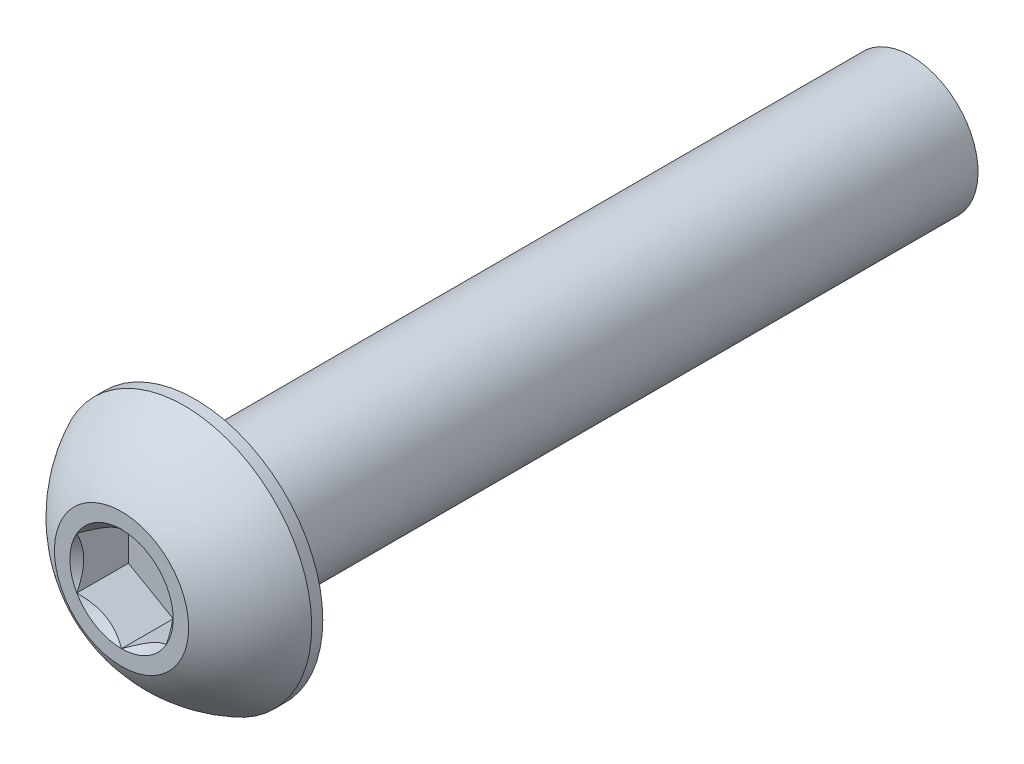
ISO-10303-21;
HEADER;
FILE_DESCRIPTION(('STEP AP214'),'2;1');
FILE_NAME('part.step','',(''),(''),'','','');
FILE_SCHEMA(('AUTOMOTIVE_DESIGN { 1 0 10303 214 1 1 1 1 }'));
ENDSEC;
DATA;
#1=APPLICATION_CONTEXT('core data for automotive mechanical design processes');
#2=APPLICATION_PROTOCOL_DEFINITION('international standard','automotive_design',2000,#1);
#3=PRODUCT_CONTEXT('',#1,'mechanical');
#4=PRODUCT('Part','Part','',(#3));
#5=PRODUCT_RELATED_PRODUCT_CATEGORY('part','',(#4));
#6=PRODUCT_DEFINITION_FORMATION('','',#4);
#7=PRODUCT_DEFINITION_CONTEXT('part definition',#1,'design');
#8=PRODUCT_DEFINITION('design','',#6,#7);
#9=PRODUCT_DEFINITION_SHAPE('','',#8);
#10=(LENGTH_UNIT() NAMED_UNIT(*) SI_UNIT(.MILLI.,.METRE.));
#11=(NAMED_UNIT(*) PLANE_ANGLE_UNIT() SI_UNIT($,.RADIAN.));
#12=(NAMED_UNIT(*) SI_UNIT($,.STERADIAN.) SOLID_ANGLE_UNIT());
#13=UNCERTAINTY_MEASURE_WITH_UNIT(LENGTH_MEASURE(1.E-05),#10,'distance_accuracy_value','');
#14=(GEOMETRIC_REPRESENTATION_CONTEXT(3) GLOBAL_UNCERTAINTY_ASSIGNED_CONTEXT((#13)) GLOBAL_UNIT_ASSIGNED_CONTEXT((#10,
#11,#12)) REPRESENTATION_CONTEXT('',''));
#15=CARTESIAN_POINT('',(0.,0.,0.));
#16=DIRECTION('',(0.,0.,1.));
#17=DIRECTION('',(1.,0.,0.));
#18=AXIS2_PLACEMENT_3D('',#15,#16,#17);
#19=CARTESIAN_POINT('',(-2.86,-2.85,-1.65));
#20=DIRECTION('',(0.,0.,-1.));
#21=DIRECTION('',(0.,1.,0.));
#22=AXIS2_PLACEMENT_3D('',#19,#20,#21);
#23=PLANE('',#22);
#24=CARTESIAN_POINT('',(0.,0.,-1.65));
#25=DIRECTION('',(0.,0.,1.));
#26=DIRECTION('',(1.,0.,0.));
#27=AXIS2_PLACEMENT_3D('',#24,#25,#26);
#28=CIRCLE('',#27,2.85);
#29=CARTESIAN_POINT('',(2.85,0.,-1.65));
#30=VERTEX_POINT('',#29);
#31=EDGE_CURVE('E371',#30,#30,#28,.T.);
#32=ORIENTED_EDGE('',*,*,#31,.F.);
#33=EDGE_LOOP('',(#32));
#34=FACE_BOUND('',#33,.T.);
#35=ADVANCED_FACE('F45',(#34),#23,.T.);
#36=CARTESIAN_POINT('',(1.,-0.577350269189626,-1.155));
#37=DIRECTION('',(0.,0.,1.));
#38=DIRECTION('',(1.,0.,0.));
#39=AXIS2_PLACEMENT_3D('',#36,#37,#38);
#40=PLANE('',#39);
#41=DIRECTION('',(0.866025403784438,0.5,0.));
#42=VECTOR('',#41,1.);
#43=CARTESIAN_POINT('',(0.,-1.15470053837925,-1.155));
#44=LINE('',#43,#42);
#45=CARTESIAN_POINT('',(0.,-1.15470053837925,-1.155));
#46=VERTEX_POINT('',#45);
#47=CARTESIAN_POINT('',(1.,-0.577350269189626,-1.155));
#48=VERTEX_POINT('',#47);
#49=EDGE_CURVE('E111',#46,#48,#44,.T.);
#50=ORIENTED_EDGE('',*,*,#49,.T.);
#51=DIRECTION('',(0.,1.,0.));
#52=VECTOR('',#51,1.);
#53=CARTESIAN_POINT('',(1.,-0.577350269189626,-1.155));
#54=LINE('',#53,#52);
#55=CARTESIAN_POINT('',(1.,0.577350269189626,-1.155));
#56=VERTEX_POINT('',#55);
#57=EDGE_CURVE('E168',#48,#56,#54,.T.);
#58=ORIENTED_EDGE('',*,*,#57,.T.);
#59=DIRECTION('',(-0.866025403784439,0.5,0.));
#60=VECTOR('',#59,1.);
#61=CARTESIAN_POINT('',(1.,0.577350269189626,-1.155));
#62=LINE('',#61,#60);
#63=CARTESIAN_POINT('',(0.,1.15470053837925,-1.155));
#64=VERTEX_POINT('',#63);
#65=EDGE_CURVE('E148',#56,#64,#62,.T.);
#66=ORIENTED_EDGE('',*,*,#65,.T.);
#67=DIRECTION('',(-0.866025403784438,-0.5,0.));
#68=VECTOR('',#67,1.);
#69=CARTESIAN_POINT('',(0.,1.15470053837925,-1.155));
#70=LINE('',#69,#68);
#71=CARTESIAN_POINT('',(-1.,0.577350269189626,-1.155));
#72=VERTEX_POINT('',#71);
#73=EDGE_CURVE('E164',#64,#72,#70,.T.);
#74=ORIENTED_EDGE('',*,*,#73,.T.);
#75=DIRECTION('',(0.,-1.,0.));
#76=VECTOR('',#75,1.);
#77=CARTESIAN_POINT('',(-1.,0.577350269189626,-1.155));
#78=LINE('',#77,#76);
#79=CARTESIAN_POINT('',(-1.,-0.577350269189626,-1.155));
#80=VERTEX_POINT('',#79);
#81=EDGE_CURVE('E161',#72,#80,#78,.T.);
#82=ORIENTED_EDGE('',*,*,#81,.T.);
#83=DIRECTION('',(0.866025403784439,-0.5,0.));
#84=VECTOR('',#83,1.);
#85=CARTESIAN_POINT('',(-1.,-0.577350269189626,-1.155));
#86=LINE('',#85,#84);
#87=EDGE_CURVE('E152',#80,#46,#86,.T.);
#88=ORIENTED_EDGE('',*,*,#87,.T.);
#89=EDGE_LOOP('',(#50,#58,#66,#74,#82,#88));
#90=FACE_BOUND('',#89,.T.);
#91=ADVANCED_FACE('F187',(#90),#40,.T.);
#92=CARTESIAN_POINT('',(-1.,-0.577350269189626,-1.155));
#93=DIRECTION('',(-0.5,-0.866025403784439,0.));
#94=DIRECTION('',(0.866025403784439,-0.5,0.));
#95=AXIS2_PLACEMENT_3D('',#92,#93,#94);
#96=PLANE('',#95);
#97=DIRECTION('',(0.,0.,1.));
#98=VECTOR('',#97,1.);
#99=CARTESIAN_POINT('',(-1.,-0.577350269189626,-1.155));
#100=LINE('',#99,#98);
#101=CARTESIAN_POINT('',(-1.,-0.577350269189626,0.));
#102=VERTEX_POINT('',#101);
#103=EDGE_CURVE('E118',#80,#102,#100,.T.);
#104=ORIENTED_EDGE('',*,*,#103,.T.);
#105=CARTESIAN_POINT('',(-1.0002,-0.577234799135788,0.000115487372614006));
#106=CARTESIAN_POINT('',(-0.965817404992819,-0.597085599618622,-0.0197220691742671));
#107=CARTESIAN_POINT('',(-0.930859881860175,-0.617268335009457,-0.0383949793611112));
#108=CARTESIAN_POINT('',(-0.859577197043911,-0.658423412276686,-0.072585257276842));
#109=CARTESIAN_POINT('',(-0.823245249471016,-0.67939967198808,-0.0880835909765412));
#110=CARTESIAN_POINT('',(-0.749983386196689,-0.721697428470847,-0.114632692857735));
#111=CARTESIAN_POINT('',(-0.713072148554586,-0.743008141459637,-0.125750226003074));
#112=CARTESIAN_POINT('',(-0.638437270689141,-0.786098608286186,-0.142880134223818));
#113=CARTESIAN_POINT('',(-0.600715911891365,-0.807877044942281,-0.148905302533327));
#114=CARTESIAN_POINT('',(-0.535707801582067,-0.845409494928863,-0.154339445032506));
#115=CARTESIAN_POINT('',(-0.508505628471828,-0.861114676896602,-0.155143061683268));
#116=CARTESIAN_POINT('',(-0.454153959330888,-0.892494627706029,-0.153793300583113));
#117=CARTESIAN_POINT('',(-0.427004476245125,-0.908169389073954,-0.151639270452801));
#118=CARTESIAN_POINT('',(-0.34594372267304,-0.954969836969511,-0.140883027871529));
#119=CARTESIAN_POINT('',(-0.292435859021573,-0.985862616452447,-0.127985443584644));
#120=CARTESIAN_POINT('',(-0.198523934856569,-1.04008269114923,-0.0968592693978226));
#121=CARTESIAN_POINT('',(-0.157679476328166,-1.06366425027551,-0.0802622022981606));
#122=CARTESIAN_POINT('',(-0.0775903626180563,-1.1099037216352,-0.0428750753147073));
#123=CARTESIAN_POINT('',(-0.0383409891295622,-1.1325643579843,-0.0220986581825968));
#124=CARTESIAN_POINT('',(0.000199999999999995,-1.15481600843309,0.000115487372613952));
#125=B_SPLINE_CURVE_WITH_KNOTS('',3,(#105,#106,#107,#108,#109,#110,#111,#112,#113,#114,#115,
#116,#117,#118,#119,#120,#121,#122,#123,#124),.UNSPECIFIED.,.F.,.F.,(4,2,2,2,2,2,2,2,2,4),(0.,
0.133237676828559,0.26725222983449,0.3991370762693,0.530689603280768,0.624814864263846,
0.718960890149132,0.907306626112097,1.05710100361789,1.20641411519286),.UNSPECIFIED.);
#126=CARTESIAN_POINT('',(0.,-1.15470053837925,0.));
#127=VERTEX_POINT('',#126);
#128=EDGE_CURVE('E103',#102,#127,#125,.T.);
#129=ORIENTED_EDGE('',*,*,#128,.T.);
#130=DIRECTION('',(0.,0.,1.));
#131=VECTOR('',#130,1.);
#132=CARTESIAN_POINT('',(0.,-1.15470053837925,-1.155));
#133=LINE('',#132,#131);
#134=EDGE_CURVE('E117',#46,#127,#133,.T.);
#135=ORIENTED_EDGE('',*,*,#134,.F.);
#136=ORIENTED_EDGE('',*,*,#87,.F.);
#137=EDGE_LOOP('',(#104,#129,#135,#136));
#138=FACE_BOUND('',#137,.T.);
#139=ADVANCED_FACE('F115',(#138),#96,.F.);
#140=CARTESIAN_POINT('',(0.,-1.15470053837925,-1.155));
#141=DIRECTION('',(0.5,-0.866025403784438,0.));
#142=DIRECTION('',(0.866025403784438,0.5,0.));
#143=AXIS2_PLACEMENT_3D('',#140,#141,#142);
#144=PLANE('',#143);
#145=ORIENTED_EDGE('',*,*,#134,.T.);
#146=CARTESIAN_POINT('',(-0.000200000000000057,-1.15481600843309,0.000115487372614094));
#147=CARTESIAN_POINT('',(0.0341825950071806,-1.13496520795026,-0.019722069174267));
#148=CARTESIAN_POINT('',(0.0691401181398248,-1.11478247255942,-0.0383949793611112));
#149=CARTESIAN_POINT('',(0.14042280295609,-1.07362739529219,-0.0725852572768421));
#150=CARTESIAN_POINT('',(0.176754750528984,-1.0526511355808,-0.0880835909765414));
#151=CARTESIAN_POINT('',(0.250016613803311,-1.01035337909803,-0.114632692857735));
#152=CARTESIAN_POINT('',(0.286927851445414,-0.989042666109241,-0.125750226003074));
#153=CARTESIAN_POINT('',(0.361562729310859,-0.945952199282691,-0.142880134223818));
#154=CARTESIAN_POINT('',(0.399284088108636,-0.924173762626596,-0.148905302533327));
#155=CARTESIAN_POINT('',(0.464292198417934,-0.886641312640014,-0.154339445032507));
#156=CARTESIAN_POINT('',(0.491494371528173,-0.870936130672275,-0.155143061683268));
#157=CARTESIAN_POINT('',(0.545846040669112,-0.839556179862848,-0.153793300583113));
#158=CARTESIAN_POINT('',(0.572995523754876,-0.823881418494923,-0.151639270452801));
#159=CARTESIAN_POINT('',(0.65405627732696,-0.777080970599366,-0.140883027871529));
#160=CARTESIAN_POINT('',(0.707564140978428,-0.74618819111643,-0.127985443584644));
#161=CARTESIAN_POINT('',(0.801476065143432,-0.691968116419649,-0.0968592693978231));
#162=CARTESIAN_POINT('',(0.842320523671834,-0.668386557293371,-0.080262202298161));
#163=CARTESIAN_POINT('',(0.922409637381944,-0.622147085933681,-0.0428750753147077));
#164=CARTESIAN_POINT('',(0.961659010870438,-0.599486449584575,-0.0220986581825972));
#165=CARTESIAN_POINT('',(1.0002,-0.577234799135788,0.000115487372613412));
#166=B_SPLINE_CURVE_WITH_KNOTS('',3,(#146,#147,#148,#149,#150,#151,#152,#153,#154,#155,#156,
#157,#158,#159,#160,#161,#162,#163,#164,#165),.UNSPECIFIED.,.F.,.F.,(4,2,2,2,2,2,2,2,2,4),(0.,
0.133237676828559,0.26725222983449,0.399137076269301,0.530689603280769,0.624814864263847,
0.718960890149134,0.907306626112098,1.05710100361789,1.20641411519286),.UNSPECIFIED.);
#167=CARTESIAN_POINT('',(1.,-0.577350269189626,0.));
#168=VERTEX_POINT('',#167);
#169=EDGE_CURVE('E108',#127,#168,#166,.T.);
#170=ORIENTED_EDGE('',*,*,#169,.T.);
#171=DIRECTION('',(0.,0.,1.));
#172=VECTOR('',#171,1.);
#173=CARTESIAN_POINT('',(1.,-0.577350269189626,-1.155));
#174=LINE('',#173,#172);
#175=EDGE_CURVE('E66',#48,#168,#174,.T.);
#176=ORIENTED_EDGE('',*,*,#175,.F.);
#177=ORIENTED_EDGE('',*,*,#49,.F.);
#178=EDGE_LOOP('',(#145,#170,#176,#177));
#179=FACE_BOUND('',#178,.T.);
#180=ADVANCED_FACE('F121',(#179),#144,.F.);
#181=CARTESIAN_POINT('',(1.,-0.577350269189626,-1.155));
#182=DIRECTION('',(1.,0.,0.));
#183=DIRECTION('',(0.,0.,-1.));
#184=AXIS2_PLACEMENT_3D('',#181,#182,#183);
#185=PLANE('',#184);
#186=ORIENTED_EDGE('',*,*,#175,.T.);
#187=CARTESIAN_POINT('',(1.,-1.15147208646462,0.370385677513861));
#188=CARTESIAN_POINT('',(1.,-1.12343447988552,0.349219919873711));
#189=CARTESIAN_POINT('',(1.,-1.09524064850697,0.328261692175909));
#190=CARTESIAN_POINT('',(1.,-1.03847715644376,0.286846022235621));
#191=CARTESIAN_POINT('',(1.,-1.00990740382975,0.266388706123658));
#192=CARTESIAN_POINT('',(1.,-0.923120894333477,0.205604794954508));
#193=CARTESIAN_POINT('',(1.,-0.864253173759059,0.166192228961397));
#194=CARTESIAN_POINT('',(1.,-0.740809858258045,0.0888206642002043));
#195=CARTESIAN_POINT('',(1.,-0.676100255137807,0.0510730391143415));
#196=CARTESIAN_POINT('',(1.,-0.543448939049124,-0.0179754124487089));
#197=CARTESIAN_POINT('',(1.,-0.475519112027779,-0.0492979721531354));
#198=CARTESIAN_POINT('',(1.,-0.373555850333529,-0.0876182211162059));
#199=CARTESIAN_POINT('',(1.,-0.341031989670907,-0.0986164083578445));
#200=CARTESIAN_POINT('',(1.,-0.275199079052293,-0.11800165785264));
#201=CARTESIAN_POINT('',(1.,-0.241889975173933,-0.126388540223302));
#202=CARTESIAN_POINT('',(1.,-0.175247517042992,-0.139974779280984));
#203=CARTESIAN_POINT('',(1.,-0.141925568218175,-0.145229209232033));
#204=CARTESIAN_POINT('',(1.,-0.0749144362322789,-0.152451313429109));
#205=CARTESIAN_POINT('',(1.,-0.0412251978501617,-0.154418486389493));
#206=CARTESIAN_POINT('',(1.,0.0249580992634211,-0.15491680160684));
#207=CARTESIAN_POINT('',(1.,0.0574512826460394,-0.153569732111366));
#208=CARTESIAN_POINT('',(1.,0.122148505701867,-0.147783515501016));
#209=CARTESIAN_POINT('',(1.,0.154352610132927,-0.143345079338465));
#210=CARTESIAN_POINT('',(1.,0.21879989886764,-0.131543169854797));
#211=CARTESIAN_POINT('',(1.,0.251033743268954,-0.124129458961492));
#212=CARTESIAN_POINT('',(1.,0.314797132354919,-0.106771057501325));
#213=CARTESIAN_POINT('',(1.,0.346326735731005,-0.096826578711171));
#214=CARTESIAN_POINT('',(1.,0.445594187730205,-0.061776517445664));
#215=CARTESIAN_POINT('',(1.,0.511919139476036,-0.0326791416432762));
#216=CARTESIAN_POINT('',(1.,0.641453244657532,0.032015329686504));
#217=CARTESIAN_POINT('',(1.,0.704650133126344,0.0676357767152409));
#218=CARTESIAN_POINT('',(1.,0.825428490174987,0.141123901346934));
#219=CARTESIAN_POINT('',(1.,0.883132947867685,0.178791947135462));
#220=CARTESIAN_POINT('',(1.,0.968148853704565,0.237022852943162));
#221=CARTESIAN_POINT('',(1.,0.996120570380285,0.256638475762855));
#222=CARTESIAN_POINT('',(1.,1.05168177729901,0.29638851706127));
#223=CARTESIAN_POINT('',(1.,1.079271369977,0.316522792198831));
#224=CARTESIAN_POINT('',(1.,1.10670185346329,0.336872119072971));
#225=B_SPLINE_CURVE_WITH_KNOTS('',3,(#187,#188,#189,#190,#191,#192,#193,#194,#195,#196,#197,
#198,#199,#200,#201,#202,#203,#204,#205,#206,#207,#208,#209,#210,#211,#212,#213,#214,#215,#216,
#217,#218,#219,#220,#221,#222,#223,#224),.UNSPECIFIED.,.F.,.F.,(4,2,2,2,2,2,2,2,2,2,2,2,2,2,2,2,
2,2,4),(0.,0.105386459083291,0.210799187330125,0.423233611565469,0.647793540908503,
0.87158087773861,0.974493074181421,1.07741235827201,1.17846428203205,1.27953161415762,
1.3769408673961,1.47432772585408,1.57343322804293,1.67253043972851,1.88917353996827,
2.10660791038813,2.31323734249843,2.41572589232045,2.51818641476503),.UNSPECIFIED.);
#226=CARTESIAN_POINT('',(1.,0.577350269189626,0.));
#227=VERTEX_POINT('',#226);
#228=EDGE_CURVE('E134',#168,#227,#225,.T.);
#229=ORIENTED_EDGE('',*,*,#228,.T.);
#230=DIRECTION('',(0.,0.,1.));
#231=VECTOR('',#230,1.);
#232=CARTESIAN_POINT('',(1.,0.577350269189626,-1.155));
#233=LINE('',#232,#231);
#234=EDGE_CURVE('E138',#56,#227,#233,.T.);
#235=ORIENTED_EDGE('',*,*,#234,.F.);
#236=ORIENTED_EDGE('',*,*,#57,.F.);
#237=EDGE_LOOP('',(#186,#229,#235,#236));
#238=FACE_BOUND('',#237,.T.);
#239=ADVANCED_FACE('F137',(#238),#185,.F.);
#240=CARTESIAN_POINT('',(1.,0.577350269189626,-1.155));
#241=DIRECTION('',(0.5,0.866025403784439,0.));
#242=DIRECTION('',(-0.866025403784439,0.5,0.));
#243=AXIS2_PLACEMENT_3D('',#240,#241,#242);
#244=PLANE('',#243);
#245=ORIENTED_EDGE('',*,*,#234,.T.);
#246=CARTESIAN_POINT('',(1.0002,0.577234799135788,0.00011548737261379));
#247=CARTESIAN_POINT('',(0.965817404992819,0.597085599618622,-0.0197220691742671));
#248=CARTESIAN_POINT('',(0.930859881860175,0.617268335009456,-0.0383949793611112));
#249=CARTESIAN_POINT('',(0.85957719704391,0.658423412276686,-0.0725852572768423));
#250=CARTESIAN_POINT('',(0.823245249471016,0.67939967198808,-0.0880835909765417));
#251=CARTESIAN_POINT('',(0.749983386196689,0.721697428470847,-0.114632692857735));
#252=CARTESIAN_POINT('',(0.713072148554586,0.743008141459637,-0.125750226003074));
#253=CARTESIAN_POINT('',(0.638437270689141,0.786098608286186,-0.142880134223818));
#254=CARTESIAN_POINT('',(0.600715911891364,0.807877044942281,-0.148905302533328));
#255=CARTESIAN_POINT('',(0.535707801582067,0.845409494928863,-0.154339445032507));
#256=CARTESIAN_POINT('',(0.508505628471828,0.861114676896602,-0.155143061683268));
#257=CARTESIAN_POINT('',(0.454153959330888,0.892494627706029,-0.153793300583113));
#258=CARTESIAN_POINT('',(0.427004476245124,0.908169389073954,-0.151639270452801));
#259=CARTESIAN_POINT('',(0.34594372267304,0.954969836969511,-0.140883027871529));
#260=CARTESIAN_POINT('',(0.292435859021573,0.985862616452447,-0.127985443584644));
#261=CARTESIAN_POINT('',(0.198523934856568,1.04008269114923,-0.0968592693978228));
#262=CARTESIAN_POINT('',(0.157679476328165,1.06366425027551,-0.0802622022981607));
#263=CARTESIAN_POINT('',(0.0775903626180559,1.1099037216352,-0.0428750753147073));
#264=CARTESIAN_POINT('',(0.0383409891295617,1.1325643579843,-0.0220986581825967));
#265=CARTESIAN_POINT('',(-0.000200000000000544,1.15481600843309,0.000115487372614062));
#266=B_SPLINE_CURVE_WITH_KNOTS('',3,(#246,#247,#248,#249,#250,#251,#252,#253,#254,#255,#256,
#257,#258,#259,#260,#261,#262,#263,#264,#265),.UNSPECIFIED.,.F.,.F.,(4,2,2,2,2,2,2,2,2,4),(0.,
0.133237676828559,0.26725222983449,0.3991370762693,0.530689603280768,0.624814864263846,
0.718960890149133,0.907306626112097,1.05710100361789,1.20641411519286),.UNSPECIFIED.);
#267=CARTESIAN_POINT('',(0.,1.15470053837925,0.));
#268=VERTEX_POINT('',#267);
#269=EDGE_CURVE('E145',#227,#268,#266,.T.);
#270=ORIENTED_EDGE('',*,*,#269,.T.);
#271=DIRECTION('',(0.,0.,1.));
#272=VECTOR('',#271,1.);
#273=CARTESIAN_POINT('',(0.,1.15470053837925,-1.155));
#274=LINE('',#273,#272);
#275=EDGE_CURVE('E150',#64,#268,#274,.T.);
#276=ORIENTED_EDGE('',*,*,#275,.F.);
#277=ORIENTED_EDGE('',*,*,#65,.F.);
#278=EDGE_LOOP('',(#245,#270,#276,#277));
#279=FACE_BOUND('',#278,.T.);
#280=ADVANCED_FACE('F144',(#279),#244,.F.);
#281=CARTESIAN_POINT('',(0.,1.15470053837925,-1.155));
#282=DIRECTION('',(-0.5,0.866025403784439,0.));
#283=DIRECTION('',(-0.866025403784439,-0.5,0.));
#284=AXIS2_PLACEMENT_3D('',#281,#282,#283);
#285=PLANE('',#284);
#286=ORIENTED_EDGE('',*,*,#275,.T.);
#287=CARTESIAN_POINT('',(0.000199999999999519,1.15481600843309,0.000115487372613877));
#288=CARTESIAN_POINT('',(-0.0341825950071811,1.13496520795026,-0.0197220691742673));
#289=CARTESIAN_POINT('',(-0.0691401181398252,1.11478247255942,-0.0383949793611114));
#290=CARTESIAN_POINT('',(-0.14042280295609,1.07362739529219,-0.0725852572768421));
#291=CARTESIAN_POINT('',(-0.176754750528985,1.0526511355808,-0.0880835909765413));
#292=CARTESIAN_POINT('',(-0.250016613803312,1.01035337909803,-0.114632692857735));
#293=CARTESIAN_POINT('',(-0.286927851445415,0.989042666109241,-0.125750226003074));
#294=CARTESIAN_POINT('',(-0.361562729310859,0.945952199282691,-0.142880134223818));
#295=CARTESIAN_POINT('',(-0.399284088108636,0.924173762626597,-0.148905302533328));
#296=CARTESIAN_POINT('',(-0.464292198417934,0.886641312640015,-0.154339445032506));
#297=CARTESIAN_POINT('',(-0.491494371528172,0.870936130672276,-0.155143061683268));
#298=CARTESIAN_POINT('',(-0.545846040669112,0.839556179862849,-0.153793300583113));
#299=CARTESIAN_POINT('',(-0.572995523754876,0.823881418494924,-0.151639270452801));
#300=CARTESIAN_POINT('',(-0.65405627732696,0.777080970599367,-0.140883027871529));
#301=CARTESIAN_POINT('',(-0.707564140978428,0.74618819111643,-0.127985443584644));
#302=CARTESIAN_POINT('',(-0.801476065143432,0.69196811641965,-0.0968592693978229));
#303=CARTESIAN_POINT('',(-0.842320523671834,0.668386557293372,-0.0802622022981609));
#304=CARTESIAN_POINT('',(-0.922409637381944,0.622147085933681,-0.0428750753147075));
#305=CARTESIAN_POINT('',(-0.961659010870438,0.599486449584575,-0.022098658182597));
#306=CARTESIAN_POINT('',(-1.0002,0.577234799135788,0.000115487372613569));
#307=B_SPLINE_CURVE_WITH_KNOTS('',3,(#287,#288,#289,#290,#291,#292,#293,#294,#295,#296,#297,
#298,#299,#300,#301,#302,#303,#304,#305,#306),.UNSPECIFIED.,.F.,.F.,(4,2,2,2,2,2,2,2,2,4),(0.,
0.133237676828559,0.26725222983449,0.3991370762693,0.530689603280768,0.624814864263846,
0.718960890149133,0.907306626112097,1.05710100361789,1.20641411519286),.UNSPECIFIED.);
#308=CARTESIAN_POINT('',(-1.,0.577350269189626,0.));
#309=VERTEX_POINT('',#308);
#310=EDGE_CURVE('E204',#268,#309,#307,.T.);
#311=ORIENTED_EDGE('',*,*,#310,.T.);
#312=DIRECTION('',(0.,0.,1.));
#313=VECTOR('',#312,1.);
#314=CARTESIAN_POINT('',(-1.,0.577350269189626,-1.155));
#315=LINE('',#314,#313);
#316=EDGE_CURVE('E154',#72,#309,#315,.T.);
#317=ORIENTED_EDGE('',*,*,#316,.F.);
#318=ORIENTED_EDGE('',*,*,#73,.F.);
#319=EDGE_LOOP('',(#286,#311,#317,#318));
#320=FACE_BOUND('',#319,.T.);
#321=ADVANCED_FACE('F218',(#320),#285,.F.);
#322=CARTESIAN_POINT('',(-1.,0.577350269189626,-1.155));
#323=DIRECTION('',(-1.,0.,0.));
#324=DIRECTION('',(0.,0.,1.));
#325=AXIS2_PLACEMENT_3D('',#322,#323,#324);
#326=PLANE('',#325);
#327=ORIENTED_EDGE('',*,*,#316,.T.);
#328=CARTESIAN_POINT('',(-1.,-1.15147208646462,0.370385677513862));
#329=CARTESIAN_POINT('',(-1.,-1.12343447988552,0.349219919873712));
#330=CARTESIAN_POINT('',(-1.,-1.09524064850697,0.32826169217591));
#331=CARTESIAN_POINT('',(-1.,-1.03847715644376,0.286846022235621));
#332=CARTESIAN_POINT('',(-1.,-1.00990740382975,0.266388706123658));
#333=CARTESIAN_POINT('',(-1.,-0.923120894333477,0.205604794954509));
#334=CARTESIAN_POINT('',(-1.,-0.86425317375906,0.166192228961397));
#335=CARTESIAN_POINT('',(-1.,-0.740809858258046,0.0888206642002046));
#336=CARTESIAN_POINT('',(-1.,-0.676100255137807,0.0510730391143418));
#337=CARTESIAN_POINT('',(-1.,-0.543448939049125,-0.0179754124487087));
#338=CARTESIAN_POINT('',(-1.,-0.475519112027779,-0.0492979721531352));
#339=CARTESIAN_POINT('',(-1.,-0.373555850333529,-0.0876182211162056));
#340=CARTESIAN_POINT('',(-1.,-0.341031989670908,-0.0986164083578442));
#341=CARTESIAN_POINT('',(-1.,-0.275199079052293,-0.11800165785264));
#342=CARTESIAN_POINT('',(-1.,-0.241889975173933,-0.126388540223301));
#343=CARTESIAN_POINT('',(-1.,-0.175247517042993,-0.139974779280984));
#344=CARTESIAN_POINT('',(-1.,-0.141925568218175,-0.145229209232033));
#345=CARTESIAN_POINT('',(-1.,-0.0749144362322791,-0.152451313429108));
#346=CARTESIAN_POINT('',(-1.,-0.0412251978501619,-0.154418486389493));
#347=CARTESIAN_POINT('',(-1.,0.0249580992634209,-0.15491680160684));
#348=CARTESIAN_POINT('',(-1.,0.0574512826460392,-0.153569732111367));
#349=CARTESIAN_POINT('',(-1.,0.122148505701867,-0.147783515501016));
#350=CARTESIAN_POINT('',(-1.,0.154352610132926,-0.143345079338465));
#351=CARTESIAN_POINT('',(-1.,0.21879989886764,-0.131543169854797));
#352=CARTESIAN_POINT('',(-1.,0.251033743268954,-0.124129458961492));
#353=CARTESIAN_POINT('',(-1.,0.314797132354919,-0.106771057501325));
#354=CARTESIAN_POINT('',(-1.,0.346326735731004,-0.0968265787111711));
#355=CARTESIAN_POINT('',(-1.,0.445594187730205,-0.0617765174456643));
#356=CARTESIAN_POINT('',(-1.,0.511919139476036,-0.0326791416432766));
#357=CARTESIAN_POINT('',(-1.,0.641453244657532,0.0320153296865037));
#358=CARTESIAN_POINT('',(-1.,0.704650133126344,0.0676357767152406));
#359=CARTESIAN_POINT('',(-1.,0.825428490174986,0.141123901346934));
#360=CARTESIAN_POINT('',(-1.,0.883132947867684,0.178791947135462));
#361=CARTESIAN_POINT('',(-1.,0.968148853704565,0.237022852943162));
#362=CARTESIAN_POINT('',(-1.,0.996120570380285,0.256638475762855));
#363=CARTESIAN_POINT('',(-1.,1.05168177729901,0.29638851706127));
#364=CARTESIAN_POINT('',(-1.,1.079271369977,0.316522792198831));
#365=CARTESIAN_POINT('',(-1.,1.10670185346329,0.33687211907297));
#366=B_SPLINE_CURVE_WITH_KNOTS('',3,(#328,#329,#330,#331,#332,#333,#334,#335,#336,#337,#338,
#339,#340,#341,#342,#343,#344,#345,#346,#347,#348,#349,#350,#351,#352,#353,#354,#355,#356,#357,
#358,#359,#360,#361,#362,#363,#364,#365),.UNSPECIFIED.,.F.,.F.,(4,2,2,2,2,2,2,2,2,2,2,2,2,2,2,2,
2,2,4),(0.,0.105386459083291,0.210799187330125,0.423233611565469,0.647793540908504,
0.87158087773861,0.974493074181421,1.07741235827201,1.17846428203205,1.27953161415762,
1.3769408673961,1.47432772585408,1.57343322804293,1.67253043972851,1.88917353996827,
2.10660791038813,2.31323734249843,2.41572589232045,2.51818641476503),.UNSPECIFIED.);
#367=EDGE_CURVE('E119',#309,#102,#366,.F.);
#368=ORIENTED_EDGE('',*,*,#367,.T.);
#369=ORIENTED_EDGE('',*,*,#103,.F.);
#370=ORIENTED_EDGE('',*,*,#81,.F.);
#371=EDGE_LOOP('',(#327,#368,#369,#370));
#372=FACE_BOUND('',#371,.T.);
#373=ADVANCED_FACE('F215',(#372),#326,.F.);
#374=CARTESIAN_POINT('',(0.,0.,0.));
#375=DIRECTION('',(0.,0.,1.));
#376=DIRECTION('',(1.,0.,0.));
#377=AXIS2_PLACEMENT_3D('',#374,#375,#376);
#378=CONICAL_SURFACE('',#377,1.15470053837925,0.78539816339745);
#379=CARTESIAN_POINT('',(0.,0.,0.));
#380=DIRECTION('',(0.,0.,1.));
#381=DIRECTION('',(1.,0.,0.));
#382=AXIS2_PLACEMENT_3D('',#379,#380,#381);
#383=CIRCLE('',#382,1.15470053837925);
#384=EDGE_CURVE('E100',#102,#127,#383,.T.);
#385=ORIENTED_EDGE('',*,*,#384,.T.);
#386=ORIENTED_EDGE('',*,*,#128,.F.);
#387=EDGE_LOOP('',(#385,#386));
#388=FACE_BOUND('',#387,.T.);
#389=ADVANCED_FACE('F101',(#388),#378,.F.);
#390=EDGE_CURVE('E53',#127,#168,#383,.T.);
#391=ORIENTED_EDGE('',*,*,#390,.T.);
#392=ORIENTED_EDGE('',*,*,#169,.F.);
#393=EDGE_LOOP('',(#391,#392));
#394=FACE_BOUND('',#393,.T.);
#395=ADVANCED_FACE('F109',(#394),#378,.F.);
#396=EDGE_CURVE('E12',#168,#227,#383,.T.);
#397=ORIENTED_EDGE('',*,*,#396,.T.);
#398=ORIENTED_EDGE('',*,*,#228,.F.);
#399=EDGE_LOOP('',(#397,#398));
#400=FACE_BOUND('',#399,.T.);
#401=ADVANCED_FACE('F133',(#400),#378,.F.);
#402=EDGE_CURVE('E48',#227,#268,#383,.T.);
#403=ORIENTED_EDGE('',*,*,#402,.T.);
#404=ORIENTED_EDGE('',*,*,#269,.F.);
#405=EDGE_LOOP('',(#403,#404));
#406=FACE_BOUND('',#405,.T.);
#407=ADVANCED_FACE('F317',(#406),#378,.F.);
#408=EDGE_CURVE('E242',#268,#309,#383,.T.);
#409=ORIENTED_EDGE('',*,*,#408,.T.);
#410=ORIENTED_EDGE('',*,*,#310,.F.);
#411=EDGE_LOOP('',(#409,#410));
#412=FACE_BOUND('',#411,.T.);
#413=ADVANCED_FACE('F243',(#412),#378,.F.);
#414=EDGE_CURVE('E107',#309,#102,#383,.T.);
#415=ORIENTED_EDGE('',*,*,#414,.T.);
#416=ORIENTED_EDGE('',*,*,#367,.F.);
#417=EDGE_LOOP('',(#415,#416));
#418=FACE_BOUND('',#417,.T.);
#419=ADVANCED_FACE('F239',(#418),#378,.F.);
#420=CARTESIAN_POINT('',(0.,-1.5,0.));
#421=DIRECTION('',(0.,0.,-1.));
#422=DIRECTION('',(-1.,0.,0.));
#423=AXIS2_PLACEMENT_3D('',#420,#421,#422);
#424=PLANE('',#423);
#425=ORIENTED_EDGE('',*,*,#414,.F.);
#426=ORIENTED_EDGE('',*,*,#408,.F.);
#427=ORIENTED_EDGE('',*,*,#402,.F.);
#428=ORIENTED_EDGE('',*,*,#396,.F.);
#429=ORIENTED_EDGE('',*,*,#390,.F.);
#430=ORIENTED_EDGE('',*,*,#384,.F.);
#431=EDGE_LOOP('',(#425,#426,#427,#428,#429,#430));
#432=FACE_BOUND('',#431,.T.);
#433=CARTESIAN_POINT('',(0.,0.,0.));
#434=DIRECTION('',(0.,0.,1.));
#435=DIRECTION('',(1.,0.,0.));
#436=AXIS2_PLACEMENT_3D('',#433,#434,#435);
#437=CIRCLE('',#436,1.5);
#438=CARTESIAN_POINT('',(0.,-1.5,0.));
#439=VERTEX_POINT('',#438);
#440=EDGE_CURVE('E140',#439,#439,#437,.T.);
#441=ORIENTED_EDGE('',*,*,#440,.T.);
#442=EDGE_LOOP('',(#441));
#443=FACE_BOUND('',#442,.T.);
#444=ADVANCED_FACE('F127',(#432,#443),#424,.F.);
#445=CARTESIAN_POINT('',(0.,0.,-2.79483288770053));
#446=DIRECTION('',(0.,0.,1.));
#447=DIRECTION('',(0.,-1.,0.));
#448=AXIS2_PLACEMENT_3D('',#445,#446,#447);
#449=SPHERICAL_SURFACE('',#448,3.17192226735973);
#450=CARTESIAN_POINT('',(0.,0.,-1.4025));
#451=DIRECTION('',(0.,0.,1.));
#452=DIRECTION('',(1.,0.,0.));
#453=AXIS2_PLACEMENT_3D('',#450,#451,#452);
#454=CIRCLE('',#453,2.85);
#455=CARTESIAN_POINT('',(0.,-2.85,-1.4025));
#456=VERTEX_POINT('',#455);
#457=EDGE_CURVE('E124',#456,#456,#454,.T.);
#458=CARTESIAN_POINT('',(0.,-1.5,0.));
#459=CARTESIAN_POINT('',(0.,-1.5181600798921,-0.00974656947336491));
#460=CARTESIAN_POINT('',(0.,-1.53622513742981,-0.0196701847238471));
#461=CARTESIAN_POINT('',(0.,-1.57215840256594,-0.0398676311293115));
#462=CARTESIAN_POINT('',(0.,-1.59002661016438,-0.0501414622842937));
#463=CARTESIAN_POINT('',(0.,-1.6255593701915,-0.0710354648490232));
#464=CARTESIAN_POINT('',(0.,-1.64322392262019,-0.0816556362587706));
#465=CARTESIAN_POINT('',(0.,-1.67834266450262,-0.103238276426967));
#466=CARTESIAN_POINT('',(0.,-1.69579685395635,-0.114200745185415));
#467=CARTESIAN_POINT('',(0.,-1.73048823664554,-0.136463816635605));
#468=CARTESIAN_POINT('',(0.,-1.74772542988099,-0.147764419327346));
#469=CARTESIAN_POINT('',(0.,-1.78197627078176,-0.170699464187152));
#470=CARTESIAN_POINT('',(0.,-1.79898991844709,-0.182333906355218));
#471=CARTESIAN_POINT('',(0.,-1.83278720341135,-0.205932209546912));
#472=CARTESIAN_POINT('',(0.,-1.84957084071028,-0.217896070570539));
#473=CARTESIAN_POINT('',(0.,-1.88290172764636,-0.242148665498754));
#474=CARTESIAN_POINT('',(0.,-1.8994489772835,-0.25443739940334));
#475=CARTESIAN_POINT('',(0.,-1.93230080139369,-0.279335070725423));
#476=CARTESIAN_POINT('',(0.,-1.94860537586673,-0.291944008142919));
#477=CARTESIAN_POINT('',(0.,-1.98096565436365,-0.317477295441111));
#478=CARTESIAN_POINT('',(0.,-1.99702135838753,-0.330401645321806));
#479=CARTESIAN_POINT('',(0.,-2.02887779526296,-0.356560846652225));
#480=CARTESIAN_POINT('',(0.,-2.04467852811452,-0.369795698101948));
#481=CARTESIAN_POINT('',(0.,-2.07601901880464,-0.396570873693306));
#482=CARTESIAN_POINT('',(0.,-2.09155877664321,-0.410111197834942));
#483=CARTESIAN_POINT('',(0.,-2.12237141262985,-0.437492173862105));
#484=CARTESIAN_POINT('',(0.,-2.13764429077792,-0.451332825747632));
#485=CARTESIAN_POINT('',(0.,-2.16791736411296,-0.479309198198267));
#486=CARTESIAN_POINT('',(0.,-2.18291755929993,-0.493444918763374));
#487=CARTESIAN_POINT('',(0.,-2.21263956705415,-0.52200605739095));
#488=CARTESIAN_POINT('',(0.,-2.22736137962139,-0.536431475453418));
#489=CARTESIAN_POINT('',(0.,-2.2565210282552,-0.56556652781647));
#490=CARTESIAN_POINT('',(0.,-2.27095886432177,-0.580276162117054));
#491=CARTESIAN_POINT('',(0.,-2.2995450739765,-0.609974057702794));
#492=CARTESIAN_POINT('',(0.,-2.31369344756465,-0.62496231898795));
#493=CARTESIAN_POINT('',(0.,-2.34169535627252,-0.655211773418758));
#494=CARTESIAN_POINT('',(0.,-2.35554889139223,-0.670472966564409));
#495=CARTESIAN_POINT('',(0.,-2.38295585920366,-0.701262485885582));
#496=CARTESIAN_POINT('',(0.,-2.39650929189537,-0.716790812061104));
#497=CARTESIAN_POINT('',(0.,-2.42331090492182,-0.748108697108241));
#498=CARTESIAN_POINT('',(0.,-2.43655908525656,-0.763898255979857));
#499=CARTESIAN_POINT('',(0.,-2.46274515962755,-0.795732606824226));
#500=CARTESIAN_POINT('',(0.,-2.47568305366379,-0.811777398796979));
#501=CARTESIAN_POINT('',(0.,-2.5012436393965,-0.844116119267125));
#502=CARTESIAN_POINT('',(0.,-2.51386633109298,-0.860410047764518));
#503=CARTESIAN_POINT('',(0.,-2.53879171587278,-0.893240850042598));
#504=CARTESIAN_POINT('',(0.,-2.55109440895612,-0.909777723823285));
#505=CARTESIAN_POINT('',(0.,-2.57537512182785,-0.943088133113638));
#506=CARTESIAN_POINT('',(0.,-2.58735314161625,-0.959861668623304));
#507=CARTESIAN_POINT('',(0.,-2.61097995657956,-0.993639027894246));
#508=CARTESIAN_POINT('',(0.,-2.62262875175448,-1.01064285165552));
#509=CARTESIAN_POINT('',(0.,-2.64559269128199,-1.04487432644225));
#510=CARTESIAN_POINT('',(0.,-2.65690783563458,-1.06210197746771));
#511=CARTESIAN_POINT('',(0.,-2.67920017403639,-1.09677456077299));
#512=CARTESIAN_POINT('',(0.,-2.69017736808561,-1.11421949305282));
#513=CARTESIAN_POINT('',(0.,-2.711789634999,-1.14932001019995));
#514=CARTESIAN_POINT('',(0.,-2.72242470786316,-1.16697559506725));
#515=CARTESIAN_POINT('',(0.,-2.74334869082117,-1.20249070903943));
#516=CARTESIAN_POINT('',(0.,-2.75363760091502,-1.22035023814429));
#517=CARTESIAN_POINT('',(0.,-2.77386535089241,-1.25626645340824));
#518=CARTESIAN_POINT('',(0.,-2.78380419077596,-1.27432313956732));
#519=CARTESIAN_POINT('',(0.,-2.80332801615778,-1.31062681184411));
#520=CARTESIAN_POINT('',(0.,-2.81291300165605,-1.32887379796182));
#521=CARTESIAN_POINT('',(0.,-2.83172550494215,-1.3655511220839));
#522=CARTESIAN_POINT('',(0.,-2.84095302272998,-1.38398146008827));
#523=CARTESIAN_POINT('',(0.,-2.85,-1.4025));
#524=B_SPLINE_CURVE_WITH_KNOTS('',3,(#458,#459,#460,#461,#462,#463,#464,#465,#466,#467,#468,
#469,#470,#471,#472,#473,#474,#475,#476,#477,#478,#479,#480,#481,#482,#483,#484,#485,#486,#487,
#488,#489,#490,#491,#492,#493,#494,#495,#496,#497,#498,#499,#500,#501,#502,#503,#504,#505,#506,
#507,#508,#509,#510,#511,#512,#513,#514,#515,#516,#517,#518,#519,#520,#521,#522,#523),
.UNSPECIFIED.,.F.,.F.,(4,2,2,2,2,2,2,2,2,2,2,2,2,2,2,2,2,2,2,2,2,2,2,2,2,2,2,2,2,2,2,2,4),(0.,
0.0618298941826981,0.123659788365397,0.185489682548094,0.247319576730793,0.309149470913491,
0.37097936509619,0.432809259278888,0.494639153461587,0.556469047644284,0.618298941826983,
0.680128836009681,0.741958730192379,0.803788624375077,0.865618518557776,0.927448412740474,
0.989278306923172,1.05110820110587,1.11293809528857,1.17476798947127,1.23659788365397,
1.29842777783666,1.36025767201936,1.42208756620206,1.48391746038476,1.54574735456746,
1.60757724875015,1.66940714293285,1.73123703711555,1.79306693129825,1.85489682548095,
1.91672671966365,1.97855661384634),.UNSPECIFIED.);
#525=EDGE_CURVE('BSEAM288',#439,#456,#524,.T.);
#526=ORIENTED_EDGE('',*,*,#440,.F.);
#527=ORIENTED_EDGE('',*,*,#457,.T.);
#528=ORIENTED_EDGE('',*,*,#525,.T.);
#529=ORIENTED_EDGE('',*,*,#525,.F.);
#530=EDGE_LOOP('',(#526,#528,#527,#529));
#531=FACE_BOUND('',#530,.T.);
#532=ADVANCED_FACE('F288',(#531),#449,.T.);
#533=CARTESIAN_POINT('',(0.,0.,0.));
#534=DIRECTION('',(0.,0.,1.));
#535=DIRECTION('',(1.,0.,0.));
#536=AXIS2_PLACEMENT_3D('',#533,#534,#535);
#537=CYLINDRICAL_SURFACE('',#536,2.85);
#538=ORIENTED_EDGE('',*,*,#457,.F.);
#539=EDGE_LOOP('',(#538));
#540=FACE_BOUND('',#539,.T.);
#541=ORIENTED_EDGE('',*,*,#31,.T.);
#542=EDGE_LOOP('',(#541));
#543=FACE_BOUND('',#542,.T.);
#544=ADVANCED_FACE('F232',(#540,#543),#537,.T.);
#545=CLOSED_SHELL('',(#35,#91,#139,#180,#239,#280,#321,#373,#389,#395,#401,#407,#413,#419,#444,
#532,#544));
#546=MANIFOLD_SOLID_BREP('B2',#545);
#547=CARTESIAN_POINT('',(-2.86,-2.85,-1.65));
#548=DIRECTION('',(0.,0.,-1.));
#549=DIRECTION('',(0.,1.,0.));
#550=AXIS2_PLACEMENT_3D('',#547,#548,#549);
#551=PLANE('',#550);
#552=CARTESIAN_POINT('',(0.,0.,-1.65));
#553=DIRECTION('',(0.,0.,1.));
#554=DIRECTION('',(1.,0.,0.));
#555=AXIS2_PLACEMENT_3D('',#552,#553,#554);
#556=CIRCLE('',#555,1.5);
#557=CARTESIAN_POINT('',(1.5,0.,-1.65));
#558=VERTEX_POINT('',#557);
#559=EDGE_CURVE('E385',#558,#558,#556,.F.);
#560=ORIENTED_EDGE('',*,*,#559,.F.);
#561=EDGE_LOOP('',(#560));
#562=FACE_BOUND('',#561,.T.);
#563=ADVANCED_FACE('F379',(#562),#551,.F.);
#564=CARTESIAN_POINT('',(0.,-1.5,-17.65));
#565=DIRECTION('',(0.,0.,-1.));
#566=DIRECTION('',(0.,1.,0.));
#567=AXIS2_PLACEMENT_3D('',#564,#565,#566);
#568=PLANE('',#567);
#569=CARTESIAN_POINT('',(0.,0.,-17.65));
#570=DIRECTION('',(0.,0.,-1.));
#571=DIRECTION('',(0.,1.,0.));
#572=AXIS2_PLACEMENT_3D('',#569,#570,#571);
#573=CIRCLE('',#572,1.5);
#574=CARTESIAN_POINT('',(0.,1.5,-17.65));
#575=VERTEX_POINT('',#574);
#576=EDGE_CURVE('E44',#575,#575,#573,.T.);
#577=ORIENTED_EDGE('',*,*,#576,.T.);
#578=EDGE_LOOP('',(#577));
#579=FACE_BOUND('',#578,.T.);
#580=ADVANCED_FACE('F395',(#579),#568,.T.);
#581=CARTESIAN_POINT('',(0.,0.,-17.65));
#582=DIRECTION('',(0.,0.,-1.));
#583=DIRECTION('',(0.,1.,0.));
#584=AXIS2_PLACEMENT_3D('',#581,#582,#583);
#585=CYLINDRICAL_SURFACE('',#584,1.5);
#586=ORIENTED_EDGE('',*,*,#559,.T.);
#587=EDGE_LOOP('',(#586));
#588=FACE_BOUND('',#587,.T.);
#589=ORIENTED_EDGE('',*,*,#576,.F.);
#590=EDGE_LOOP('',(#589));
#591=FACE_BOUND('',#590,.T.);
#592=ADVANCED_FACE('F391',(#588,#591),#585,.T.);
#593=CLOSED_SHELL('',(#563,#580,#592));
#594=MANIFOLD_SOLID_BREP('B6',#593);
#595=ADVANCED_BREP_SHAPE_REPRESENTATION('',(#18,#546,#594),#14);
#596=SHAPE_DEFINITION_REPRESENTATION(#9,#595);
ENDSEC;
END-ISO-10303-21;
